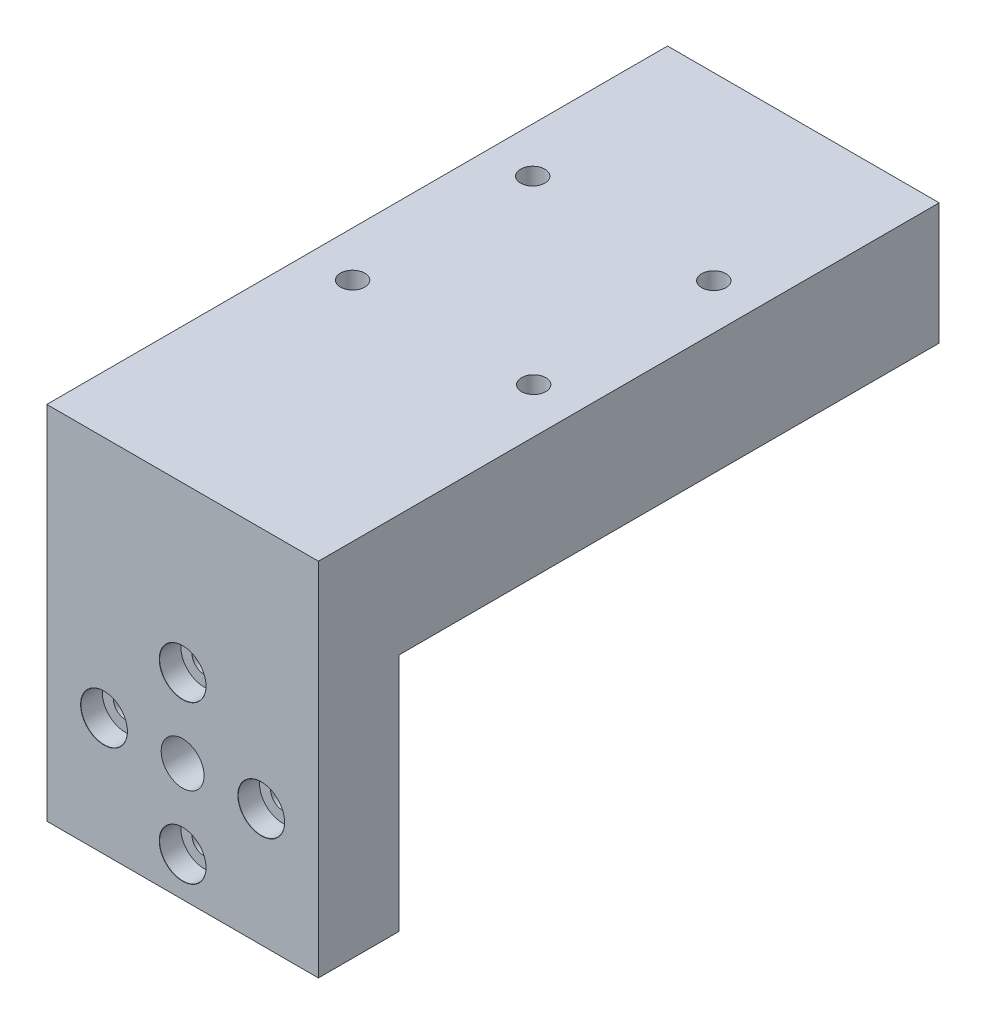
ISO-10303-21;
HEADER;
FILE_DESCRIPTION(('STEP AP214'),'2;1');
FILE_NAME('part.step','',(''),(''),'','','');
FILE_SCHEMA(('AUTOMOTIVE_DESIGN { 1 0 10303 214 1 1 1 1 }'));
ENDSEC;
DATA;
#1=APPLICATION_CONTEXT('core data for automotive mechanical design processes');
#2=APPLICATION_PROTOCOL_DEFINITION('international standard','automotive_design',2000,#1);
#3=PRODUCT_CONTEXT('',#1,'mechanical');
#4=PRODUCT('Part','Part','',(#3));
#5=PRODUCT_RELATED_PRODUCT_CATEGORY('part','',(#4));
#6=PRODUCT_DEFINITION_FORMATION('','',#4);
#7=PRODUCT_DEFINITION_CONTEXT('part definition',#1,'design');
#8=PRODUCT_DEFINITION('design','',#6,#7);
#9=PRODUCT_DEFINITION_SHAPE('','',#8);
#10=(LENGTH_UNIT() NAMED_UNIT(*) SI_UNIT(.MILLI.,.METRE.));
#11=(NAMED_UNIT(*) PLANE_ANGLE_UNIT() SI_UNIT($,.RADIAN.));
#12=(NAMED_UNIT(*) SI_UNIT($,.STERADIAN.) SOLID_ANGLE_UNIT());
#13=UNCERTAINTY_MEASURE_WITH_UNIT(LENGTH_MEASURE(1.E-05),#10,'distance_accuracy_value','');
#14=(GEOMETRIC_REPRESENTATION_CONTEXT(3) GLOBAL_UNCERTAINTY_ASSIGNED_CONTEXT((#13)) GLOBAL_UNIT_ASSIGNED_CONTEXT((#10,
#11,#12)) REPRESENTATION_CONTEXT('',''));
#15=CARTESIAN_POINT('',(0.,0.,0.));
#16=DIRECTION('',(0.,0.,1.));
#17=DIRECTION('',(1.,0.,0.));
#18=AXIS2_PLACEMENT_3D('',#15,#16,#17);
#19=CARTESIAN_POINT('',(0.,0.,36.6));
#20=DIRECTION('',(0.,0.,1.));
#21=DIRECTION('',(1.,0.,0.));
#22=AXIS2_PLACEMENT_3D('',#19,#20,#21);
#23=PLANE('',#22);
#24=CARTESIAN_POINT('',(0.,11.,36.6));
#25=DIRECTION('',(0.,0.,1.));
#26=DIRECTION('',(1.,0.,0.));
#27=AXIS2_PLACEMENT_3D('',#24,#25,#26);
#28=CIRCLE('',#27,1.69999999999999);
#29=CARTESIAN_POINT('',(1.69999999999999,11.,36.6));
#30=VERTEX_POINT('',#29);
#31=EDGE_CURVE('E3342',#30,#30,#28,.T.);
#32=ORIENTED_EDGE('',*,*,#31,.T.);
#33=EDGE_LOOP('',(#32));
#34=FACE_BOUND('',#33,.T.);
#35=CARTESIAN_POINT('',(11.,0.,36.6));
#36=DIRECTION('',(0.,0.,1.));
#37=DIRECTION('',(1.,0.,0.));
#38=AXIS2_PLACEMENT_3D('',#35,#36,#37);
#39=CIRCLE('',#38,1.69999999999999);
#40=CARTESIAN_POINT('',(12.7,0.,36.6));
#41=VERTEX_POINT('',#40);
#42=EDGE_CURVE('E3427',#41,#41,#39,.T.);
#43=ORIENTED_EDGE('',*,*,#42,.T.);
#44=EDGE_LOOP('',(#43));
#45=FACE_BOUND('',#44,.T.);
#46=CARTESIAN_POINT('',(0.,-11.,36.6));
#47=DIRECTION('',(0.,0.,1.));
#48=DIRECTION('',(1.,0.,0.));
#49=AXIS2_PLACEMENT_3D('',#46,#47,#48);
#50=CIRCLE('',#49,1.69999999999999);
#51=CARTESIAN_POINT('',(1.69999999999999,-11.,36.6));
#52=VERTEX_POINT('',#51);
#53=EDGE_CURVE('E3421',#52,#52,#50,.T.);
#54=ORIENTED_EDGE('',*,*,#53,.T.);
#55=EDGE_LOOP('',(#54));
#56=FACE_BOUND('',#55,.T.);
#57=CARTESIAN_POINT('',(-11.,0.,36.6));
#58=DIRECTION('',(0.,0.,1.));
#59=DIRECTION('',(1.,0.,0.));
#60=AXIS2_PLACEMENT_3D('',#57,#58,#59);
#61=CIRCLE('',#60,1.69999999999999);
#62=CARTESIAN_POINT('',(-9.30000000000001,0.,36.6));
#63=VERTEX_POINT('',#62);
#64=EDGE_CURVE('E3413',#63,#63,#61,.T.);
#65=ORIENTED_EDGE('',*,*,#64,.T.);
#66=EDGE_LOOP('',(#65));
#67=FACE_BOUND('',#66,.T.);
#68=CARTESIAN_POINT('',(0.,0.,36.6));
#69=DIRECTION('',(0.,0.,-1.));
#70=DIRECTION('',(-1.,0.,0.));
#71=AXIS2_PLACEMENT_3D('',#68,#69,#70);
#72=CIRCLE('',#71,9.05);
#73=CARTESIAN_POINT('',(-9.05,0.,36.6));
#74=VERTEX_POINT('',#73);
#75=EDGE_CURVE('E3478',#74,#74,#72,.T.);
#76=ORIENTED_EDGE('',*,*,#75,.F.);
#77=EDGE_LOOP('',(#76));
#78=FACE_BOUND('',#77,.T.);
#79=DIRECTION('',(0.,-1.,0.));
#80=VECTOR('',#79,1.);
#81=CARTESIAN_POINT('',(19.,0.,36.6));
#82=LINE('',#81,#80);
#83=CARTESIAN_POINT('',(19.,17.,36.6));
#84=VERTEX_POINT('',#83);
#85=CARTESIAN_POINT('',(19.,-16.5,36.6));
#86=VERTEX_POINT('',#85);
#87=EDGE_CURVE('E3382',#84,#86,#82,.T.);
#88=ORIENTED_EDGE('',*,*,#87,.T.);
#89=DIRECTION('',(1.,0.,0.));
#90=VECTOR('',#89,1.);
#91=CARTESIAN_POINT('',(0.,-16.5,36.6));
#92=LINE('',#91,#90);
#93=CARTESIAN_POINT('',(-19.,-16.5,36.6));
#94=VERTEX_POINT('',#93);
#95=EDGE_CURVE('E3395',#94,#86,#92,.T.);
#96=ORIENTED_EDGE('',*,*,#95,.F.);
#97=DIRECTION('',(0.,-1.,0.));
#98=VECTOR('',#97,1.);
#99=CARTESIAN_POINT('',(-19.,0.,36.6));
#100=LINE('',#99,#98);
#101=CARTESIAN_POINT('',(-19.,17.,36.6));
#102=VERTEX_POINT('',#101);
#103=EDGE_CURVE('E3374',#102,#94,#100,.T.);
#104=ORIENTED_EDGE('',*,*,#103,.F.);
#105=DIRECTION('',(1.,0.,0.));
#106=VECTOR('',#105,1.);
#107=CARTESIAN_POINT('',(0.,17.,36.6));
#108=LINE('',#107,#106);
#109=EDGE_CURVE('E3398',#102,#84,#108,.T.);
#110=ORIENTED_EDGE('',*,*,#109,.T.);
#111=EDGE_LOOP('',(#88,#96,#104,#110));
#112=FACE_BOUND('',#111,.T.);
#113=ADVANCED_FACE('F3337',(#34,#45,#56,#67,#78,#112),#23,.F.);
#114=CARTESIAN_POINT('',(-19.,0.,47.85));
#115=DIRECTION('',(1.,0.,0.));
#116=DIRECTION('',(0.,1.,0.));
#117=AXIS2_PLACEMENT_3D('',#114,#115,#116);
#118=PLANE('',#117);
#119=ORIENTED_EDGE('',*,*,#103,.T.);
#120=DIRECTION('',(0.,0.,-1.));
#121=VECTOR('',#120,1.);
#122=CARTESIAN_POINT('',(-19.,-16.5,47.85));
#123=LINE('',#122,#121);
#124=CARTESIAN_POINT('',(-19.,-16.5,47.85));
#125=VERTEX_POINT('',#124);
#126=EDGE_CURVE('E3351',#125,#94,#123,.T.);
#127=ORIENTED_EDGE('',*,*,#126,.F.);
#128=DIRECTION('',(0.,-1.,0.));
#129=VECTOR('',#128,1.);
#130=CARTESIAN_POINT('',(-19.,0.,47.85));
#131=LINE('',#130,#129);
#132=CARTESIAN_POINT('',(-19.,34.,47.85));
#133=VERTEX_POINT('',#132);
#134=EDGE_CURVE('E3516',#133,#125,#131,.T.);
#135=ORIENTED_EDGE('',*,*,#134,.F.);
#136=DIRECTION('',(0.,0.,1.));
#137=VECTOR('',#136,1.);
#138=CARTESIAN_POINT('',(-19.,34.,-39.));
#139=LINE('',#138,#137);
#140=CARTESIAN_POINT('',(-19.,34.,-39.));
#141=VERTEX_POINT('',#140);
#142=EDGE_CURVE('E3507',#141,#133,#139,.T.);
#143=ORIENTED_EDGE('',*,*,#142,.F.);
#144=DIRECTION('',(0.,1.,0.));
#145=VECTOR('',#144,1.);
#146=CARTESIAN_POINT('',(-19.,0.,-39.));
#147=LINE('',#146,#145);
#148=CARTESIAN_POINT('',(-19.,17.,-39.));
#149=VERTEX_POINT('',#148);
#150=EDGE_CURVE('E3496',#149,#141,#147,.T.);
#151=ORIENTED_EDGE('',*,*,#150,.F.);
#152=DIRECTION('',(0.,0.,1.));
#153=VECTOR('',#152,1.);
#154=CARTESIAN_POINT('',(-19.,17.,-39.));
#155=LINE('',#154,#153);
#156=EDGE_CURVE('E3406',#149,#102,#155,.T.);
#157=ORIENTED_EDGE('',*,*,#156,.T.);
#158=EDGE_LOOP('',(#119,#127,#135,#143,#151,#157));
#159=FACE_BOUND('',#158,.T.);
#160=ADVANCED_FACE('F3529',(#159),#118,.F.);
#161=CARTESIAN_POINT('',(19.,0.,47.85));
#162=DIRECTION('',(1.,0.,0.));
#163=DIRECTION('',(0.,1.,0.));
#164=AXIS2_PLACEMENT_3D('',#161,#162,#163);
#165=PLANE('',#164);
#166=ORIENTED_EDGE('',*,*,#87,.F.);
#167=DIRECTION('',(0.,0.,1.));
#168=VECTOR('',#167,1.);
#169=CARTESIAN_POINT('',(19.,17.,-39.));
#170=LINE('',#169,#168);
#171=CARTESIAN_POINT('',(19.,17.,-39.));
#172=VERTEX_POINT('',#171);
#173=EDGE_CURVE('E3399',#172,#84,#170,.T.);
#174=ORIENTED_EDGE('',*,*,#173,.F.);
#175=DIRECTION('',(0.,-1.,0.));
#176=VECTOR('',#175,1.);
#177=CARTESIAN_POINT('',(19.,0.,-39.));
#178=LINE('',#177,#176);
#179=CARTESIAN_POINT('',(19.,34.,-39.));
#180=VERTEX_POINT('',#179);
#181=EDGE_CURVE('E3486',#180,#172,#178,.T.);
#182=ORIENTED_EDGE('',*,*,#181,.F.);
#183=DIRECTION('',(0.,0.,1.));
#184=VECTOR('',#183,1.);
#185=CARTESIAN_POINT('',(19.,34.,-39.));
#186=LINE('',#185,#184);
#187=CARTESIAN_POINT('',(19.,34.,47.85));
#188=VERTEX_POINT('',#187);
#189=EDGE_CURVE('E3502',#180,#188,#186,.T.);
#190=ORIENTED_EDGE('',*,*,#189,.T.);
#191=DIRECTION('',(0.,-1.,0.));
#192=VECTOR('',#191,1.);
#193=CARTESIAN_POINT('',(19.,0.,47.85));
#194=LINE('',#193,#192);
#195=CARTESIAN_POINT('',(19.,-16.5,47.85));
#196=VERTEX_POINT('',#195);
#197=EDGE_CURVE('E3387',#188,#196,#194,.T.);
#198=ORIENTED_EDGE('',*,*,#197,.T.);
#199=DIRECTION('',(0.,0.,-1.));
#200=VECTOR('',#199,1.);
#201=CARTESIAN_POINT('',(19.,-16.5,47.85));
#202=LINE('',#201,#200);
#203=EDGE_CURVE('E3376',#196,#86,#202,.T.);
#204=ORIENTED_EDGE('',*,*,#203,.T.);
#205=EDGE_LOOP('',(#166,#174,#182,#190,#198,#204));
#206=FACE_BOUND('',#205,.T.);
#207=ADVANCED_FACE('F3345',(#206),#165,.T.);
#208=CARTESIAN_POINT('',(0.,-16.5,47.85));
#209=DIRECTION('',(0.,1.,0.));
#210=DIRECTION('',(0.,0.,1.));
#211=AXIS2_PLACEMENT_3D('',#208,#209,#210);
#212=PLANE('',#211);
#213=ORIENTED_EDGE('',*,*,#95,.T.);
#214=ORIENTED_EDGE('',*,*,#203,.F.);
#215=DIRECTION('',(1.,0.,0.));
#216=VECTOR('',#215,1.);
#217=CARTESIAN_POINT('',(0.,-16.5,47.85));
#218=LINE('',#217,#216);
#219=EDGE_CURVE('E3358',#125,#196,#218,.T.);
#220=ORIENTED_EDGE('',*,*,#219,.F.);
#221=ORIENTED_EDGE('',*,*,#126,.T.);
#222=EDGE_LOOP('',(#213,#214,#220,#221));
#223=FACE_BOUND('',#222,.T.);
#224=ADVANCED_FACE('F3391',(#223),#212,.F.);
#225=CARTESIAN_POINT('',(0.,0.,47.85));
#226=DIRECTION('',(0.,0.,1.));
#227=DIRECTION('',(1.,0.,0.));
#228=AXIS2_PLACEMENT_3D('',#225,#226,#227);
#229=PLANE('',#228);
#230=CARTESIAN_POINT('',(0.,11.,47.85));
#231=DIRECTION('',(0.,0.,1.));
#232=DIRECTION('',(1.,0.,0.));
#233=AXIS2_PLACEMENT_3D('',#230,#231,#232);
#234=CIRCLE('',#233,3.275);
#235=CARTESIAN_POINT('',(3.275,11.,47.85));
#236=VERTEX_POINT('',#235);
#237=EDGE_CURVE('E3777',#236,#236,#234,.T.);
#238=ORIENTED_EDGE('',*,*,#237,.F.);
#239=EDGE_LOOP('',(#238));
#240=FACE_BOUND('',#239,.T.);
#241=CARTESIAN_POINT('',(11.,0.,47.85));
#242=DIRECTION('',(0.,0.,1.));
#243=DIRECTION('',(1.,0.,0.));
#244=AXIS2_PLACEMENT_3D('',#241,#242,#243);
#245=CIRCLE('',#244,3.275);
#246=CARTESIAN_POINT('',(14.275,0.,47.85));
#247=VERTEX_POINT('',#246);
#248=EDGE_CURVE('E3797',#247,#247,#245,.T.);
#249=ORIENTED_EDGE('',*,*,#248,.F.);
#250=EDGE_LOOP('',(#249));
#251=FACE_BOUND('',#250,.T.);
#252=CARTESIAN_POINT('',(0.,-11.,47.85));
#253=DIRECTION('',(0.,0.,1.));
#254=DIRECTION('',(1.,0.,0.));
#255=AXIS2_PLACEMENT_3D('',#252,#253,#254);
#256=CIRCLE('',#255,3.275);
#257=CARTESIAN_POINT('',(3.275,-11.,47.85));
#258=VERTEX_POINT('',#257);
#259=EDGE_CURVE('E3429',#258,#258,#256,.T.);
#260=ORIENTED_EDGE('',*,*,#259,.F.);
#261=EDGE_LOOP('',(#260));
#262=FACE_BOUND('',#261,.T.);
#263=CARTESIAN_POINT('',(-11.,0.,47.85));
#264=DIRECTION('',(0.,0.,1.));
#265=DIRECTION('',(1.,0.,0.));
#266=AXIS2_PLACEMENT_3D('',#263,#264,#265);
#267=CIRCLE('',#266,3.275);
#268=CARTESIAN_POINT('',(-7.725,0.,47.85));
#269=VERTEX_POINT('',#268);
#270=EDGE_CURVE('E3422',#269,#269,#267,.T.);
#271=ORIENTED_EDGE('',*,*,#270,.F.);
#272=EDGE_LOOP('',(#271));
#273=FACE_BOUND('',#272,.T.);
#274=CARTESIAN_POINT('',(0.,0.,47.85));
#275=DIRECTION('',(0.,0.,1.));
#276=DIRECTION('',(1.,0.,0.));
#277=AXIS2_PLACEMENT_3D('',#274,#275,#276);
#278=CIRCLE('',#277,3.);
#279=CARTESIAN_POINT('',(3.,0.,47.85));
#280=VERTEX_POINT('',#279);
#281=EDGE_CURVE('E12',#280,#280,#278,.T.);
#282=ORIENTED_EDGE('',*,*,#281,.F.);
#283=EDGE_LOOP('',(#282));
#284=FACE_BOUND('',#283,.T.);
#285=ORIENTED_EDGE('',*,*,#197,.F.);
#286=DIRECTION('',(1.,0.,0.));
#287=VECTOR('',#286,1.);
#288=CARTESIAN_POINT('',(0.,34.,47.85));
#289=LINE('',#288,#287);
#290=EDGE_CURVE('E3481',#133,#188,#289,.T.);
#291=ORIENTED_EDGE('',*,*,#290,.F.);
#292=ORIENTED_EDGE('',*,*,#134,.T.);
#293=ORIENTED_EDGE('',*,*,#219,.T.);
#294=EDGE_LOOP('',(#285,#291,#292,#293));
#295=FACE_BOUND('',#294,.T.);
#296=ADVANCED_FACE('F3527',(#240,#251,#262,#273,#284,#295),#229,.T.);
#297=CARTESIAN_POINT('',(0.,17.,-39.));
#298=DIRECTION('',(0.,-1.,0.));
#299=DIRECTION('',(0.,0.,-1.));
#300=AXIS2_PLACEMENT_3D('',#297,#298,#299);
#301=PLANE('',#300);
#302=CARTESIAN_POINT('',(-12.6666666666667,17.,11.4));
#303=DIRECTION('',(0.,-1.,0.));
#304=DIRECTION('',(0.,0.,-1.));
#305=AXIS2_PLACEMENT_3D('',#302,#303,#304);
#306=CIRCLE('',#305,3.275);
#307=CARTESIAN_POINT('',(-12.6666666666667,17.,8.125));
#308=VERTEX_POINT('',#307);
#309=EDGE_CURVE('E3702',#308,#308,#306,.T.);
#310=ORIENTED_EDGE('',*,*,#309,.F.);
#311=EDGE_LOOP('',(#310));
#312=FACE_BOUND('',#311,.T.);
#313=CARTESIAN_POINT('',(12.6666666666667,17.,11.4));
#314=DIRECTION('',(0.,-1.,0.));
#315=DIRECTION('',(0.,0.,-1.));
#316=AXIS2_PLACEMENT_3D('',#313,#314,#315);
#317=CIRCLE('',#316,3.275);
#318=CARTESIAN_POINT('',(12.6666666666667,17.,8.125));
#319=VERTEX_POINT('',#318);
#320=EDGE_CURVE('E3719',#319,#319,#317,.T.);
#321=ORIENTED_EDGE('',*,*,#320,.F.);
#322=EDGE_LOOP('',(#321));
#323=FACE_BOUND('',#322,.T.);
#324=CARTESIAN_POINT('',(12.6666666666667,17.,-13.8));
#325=DIRECTION('',(0.,-1.,0.));
#326=DIRECTION('',(0.,0.,-1.));
#327=AXIS2_PLACEMENT_3D('',#324,#325,#326);
#328=CIRCLE('',#327,3.275);
#329=CARTESIAN_POINT('',(12.6666666666667,17.,-17.075));
#330=VERTEX_POINT('',#329);
#331=EDGE_CURVE('E3739',#330,#330,#328,.T.);
#332=ORIENTED_EDGE('',*,*,#331,.F.);
#333=EDGE_LOOP('',(#332));
#334=FACE_BOUND('',#333,.T.);
#335=CARTESIAN_POINT('',(-12.6666666666667,17.,-13.8));
#336=DIRECTION('',(0.,-1.,0.));
#337=DIRECTION('',(0.,0.,-1.));
#338=AXIS2_PLACEMENT_3D('',#335,#336,#337);
#339=CIRCLE('',#338,3.275);
#340=CARTESIAN_POINT('',(-12.6666666666667,17.,-17.075));
#341=VERTEX_POINT('',#340);
#342=EDGE_CURVE('E3758',#341,#341,#339,.T.);
#343=ORIENTED_EDGE('',*,*,#342,.F.);
#344=EDGE_LOOP('',(#343));
#345=FACE_BOUND('',#344,.T.);
#346=ORIENTED_EDGE('',*,*,#109,.F.);
#347=ORIENTED_EDGE('',*,*,#156,.F.);
#348=DIRECTION('',(1.,0.,0.));
#349=VECTOR('',#348,1.);
#350=CARTESIAN_POINT('',(0.,17.,-39.));
#351=LINE('',#350,#349);
#352=EDGE_CURVE('E3505',#149,#172,#351,.T.);
#353=ORIENTED_EDGE('',*,*,#352,.T.);
#354=ORIENTED_EDGE('',*,*,#173,.T.);
#355=EDGE_LOOP('',(#346,#347,#353,#354));
#356=FACE_BOUND('',#355,.T.);
#357=ADVANCED_FACE('F3545',(#312,#323,#334,#345,#356),#301,.T.);
#358=CARTESIAN_POINT('',(0.,34.,-39.));
#359=DIRECTION('',(0.,-1.,0.));
#360=DIRECTION('',(0.,0.,-1.));
#361=AXIS2_PLACEMENT_3D('',#358,#359,#360);
#362=PLANE('',#361);
#363=CARTESIAN_POINT('',(-12.6666666666667,34.,11.4));
#364=DIRECTION('',(0.,-1.,0.));
#365=DIRECTION('',(0.,0.,-1.));
#366=AXIS2_PLACEMENT_3D('',#363,#364,#365);
#367=CIRCLE('',#366,1.7);
#368=CARTESIAN_POINT('',(-12.6666666666667,34.,9.7));
#369=VERTEX_POINT('',#368);
#370=EDGE_CURVE('E3718',#369,#369,#367,.T.);
#371=ORIENTED_EDGE('',*,*,#370,.T.);
#372=EDGE_LOOP('',(#371));
#373=FACE_BOUND('',#372,.T.);
#374=CARTESIAN_POINT('',(12.6666666666667,34.,11.4));
#375=DIRECTION('',(0.,-1.,0.));
#376=DIRECTION('',(0.,0.,-1.));
#377=AXIS2_PLACEMENT_3D('',#374,#375,#376);
#378=CIRCLE('',#377,1.7);
#379=CARTESIAN_POINT('',(12.6666666666667,34.,9.7));
#380=VERTEX_POINT('',#379);
#381=EDGE_CURVE('E3736',#380,#380,#378,.T.);
#382=ORIENTED_EDGE('',*,*,#381,.T.);
#383=EDGE_LOOP('',(#382));
#384=FACE_BOUND('',#383,.T.);
#385=CARTESIAN_POINT('',(12.6666666666667,34.,-13.8));
#386=DIRECTION('',(0.,-1.,0.));
#387=DIRECTION('',(0.,0.,-1.));
#388=AXIS2_PLACEMENT_3D('',#385,#386,#387);
#389=CIRCLE('',#388,1.7);
#390=CARTESIAN_POINT('',(12.6666666666667,34.,-15.5));
#391=VERTEX_POINT('',#390);
#392=EDGE_CURVE('E3757',#391,#391,#389,.T.);
#393=ORIENTED_EDGE('',*,*,#392,.T.);
#394=EDGE_LOOP('',(#393));
#395=FACE_BOUND('',#394,.T.);
#396=CARTESIAN_POINT('',(-12.6666666666667,34.,-13.8));
#397=DIRECTION('',(0.,-1.,0.));
#398=DIRECTION('',(0.,0.,-1.));
#399=AXIS2_PLACEMENT_3D('',#396,#397,#398);
#400=CIRCLE('',#399,1.7);
#401=CARTESIAN_POINT('',(-12.6666666666667,34.,-15.5));
#402=VERTEX_POINT('',#401);
#403=EDGE_CURVE('E3778',#402,#402,#400,.T.);
#404=ORIENTED_EDGE('',*,*,#403,.T.);
#405=EDGE_LOOP('',(#404));
#406=FACE_BOUND('',#405,.T.);
#407=ORIENTED_EDGE('',*,*,#142,.T.);
#408=ORIENTED_EDGE('',*,*,#290,.T.);
#409=ORIENTED_EDGE('',*,*,#189,.F.);
#410=DIRECTION('',(1.,0.,0.));
#411=VECTOR('',#410,1.);
#412=CARTESIAN_POINT('',(0.,34.,-39.));
#413=LINE('',#412,#411);
#414=EDGE_CURVE('E3492',#141,#180,#413,.T.);
#415=ORIENTED_EDGE('',*,*,#414,.F.);
#416=EDGE_LOOP('',(#407,#408,#409,#415));
#417=FACE_BOUND('',#416,.T.);
#418=ADVANCED_FACE('F3544',(#373,#384,#395,#406,#417),#362,.F.);
#419=CARTESIAN_POINT('',(0.,0.,-39.));
#420=DIRECTION('',(0.,0.,1.));
#421=DIRECTION('',(1.,0.,0.));
#422=AXIS2_PLACEMENT_3D('',#419,#420,#421);
#423=PLANE('',#422);
#424=ORIENTED_EDGE('',*,*,#181,.T.);
#425=ORIENTED_EDGE('',*,*,#352,.F.);
#426=ORIENTED_EDGE('',*,*,#150,.T.);
#427=ORIENTED_EDGE('',*,*,#414,.T.);
#428=EDGE_LOOP('',(#424,#425,#426,#427));
#429=FACE_BOUND('',#428,.T.);
#430=ADVANCED_FACE('F3550',(#429),#423,.F.);
#431=CARTESIAN_POINT('',(0.,0.,38.6));
#432=DIRECTION('',(0.,0.,-1.));
#433=DIRECTION('',(-1.,0.,0.));
#434=AXIS2_PLACEMENT_3D('',#431,#432,#433);
#435=CYLINDRICAL_SURFACE('',#434,9.05);
#436=CARTESIAN_POINT('',(0.,0.,38.6));
#437=DIRECTION('',(0.,0.,-1.));
#438=DIRECTION('',(-1.,0.,0.));
#439=AXIS2_PLACEMENT_3D('',#436,#437,#438);
#440=CIRCLE('',#439,9.05);
#441=CARTESIAN_POINT('',(-9.05,0.,38.6));
#442=VERTEX_POINT('',#441);
#443=EDGE_CURVE('E3477',#442,#442,#440,.T.);
#444=ORIENTED_EDGE('',*,*,#443,.F.);
#445=EDGE_LOOP('',(#444));
#446=FACE_BOUND('',#445,.T.);
#447=ORIENTED_EDGE('',*,*,#75,.T.);
#448=EDGE_LOOP('',(#447));
#449=FACE_BOUND('',#448,.T.);
#450=ADVANCED_FACE('F3555',(#446,#449),#435,.F.);
#451=CARTESIAN_POINT('',(0.,0.,38.6));
#452=DIRECTION('',(0.,0.,-1.));
#453=DIRECTION('',(-1.,0.,0.));
#454=AXIS2_PLACEMENT_3D('',#451,#452,#453);
#455=PLANE('',#454);
#456=CARTESIAN_POINT('',(0.,0.,38.6));
#457=DIRECTION('',(0.,0.,-1.));
#458=DIRECTION('',(-1.,0.,0.));
#459=AXIS2_PLACEMENT_3D('',#456,#457,#458);
#460=CIRCLE('',#459,3.);
#461=CARTESIAN_POINT('',(-3.,0.,38.6));
#462=VERTEX_POINT('',#461);
#463=EDGE_CURVE('E3419',#462,#462,#460,.T.);
#464=ORIENTED_EDGE('',*,*,#463,.F.);
#465=EDGE_LOOP('',(#464));
#466=FACE_BOUND('',#465,.T.);
#467=ORIENTED_EDGE('',*,*,#443,.T.);
#468=EDGE_LOOP('',(#467));
#469=FACE_BOUND('',#468,.T.);
#470=ADVANCED_FACE('F3556',(#466,#469),#455,.T.);
#471=CARTESIAN_POINT('',(0.,0.,54.601));
#472=DIRECTION('',(0.,0.,-1.));
#473=DIRECTION('',(-1.,0.,0.));
#474=AXIS2_PLACEMENT_3D('',#471,#472,#473);
#475=CYLINDRICAL_SURFACE('',#474,3.);
#476=ORIENTED_EDGE('',*,*,#281,.T.);
#477=EDGE_LOOP('',(#476));
#478=FACE_BOUND('',#477,.T.);
#479=ORIENTED_EDGE('',*,*,#463,.T.);
#480=EDGE_LOOP('',(#479));
#481=FACE_BOUND('',#480,.T.);
#482=ADVANCED_FACE('F3565',(#478,#481),#475,.F.);
#483=CARTESIAN_POINT('',(-11.,0.,47.85));
#484=DIRECTION('',(0.,0.,1.));
#485=DIRECTION('',(1.,0.,0.));
#486=AXIS2_PLACEMENT_3D('',#483,#484,#485);
#487=CYLINDRICAL_SURFACE('',#486,1.69999999999999);
#488=CARTESIAN_POINT('',(-11.,0.,44.85));
#489=DIRECTION('',(0.,0.,1.));
#490=DIRECTION('',(1.,0.,0.));
#491=AXIS2_PLACEMENT_3D('',#488,#489,#490);
#492=CIRCLE('',#491,1.7);
#493=CARTESIAN_POINT('',(-9.3,0.,44.85));
#494=VERTEX_POINT('',#493);
#495=EDGE_CURVE('E3416',#494,#494,#492,.T.);
#496=ORIENTED_EDGE('',*,*,#495,.T.);
#497=EDGE_LOOP('',(#496));
#498=FACE_BOUND('',#497,.T.);
#499=ORIENTED_EDGE('',*,*,#64,.F.);
#500=EDGE_LOOP('',(#499));
#501=FACE_BOUND('',#500,.T.);
#502=ADVANCED_FACE('F3566',(#498,#501),#487,.F.);
#503=CARTESIAN_POINT('',(-7.75,0.,44.85));
#504=DIRECTION('',(0.,0.,-1.));
#505=DIRECTION('',(-1.,0.,0.));
#506=AXIS2_PLACEMENT_3D('',#503,#504,#505);
#507=PLANE('',#506);
#508=ORIENTED_EDGE('',*,*,#495,.F.);
#509=EDGE_LOOP('',(#508));
#510=FACE_BOUND('',#509,.T.);
#511=CARTESIAN_POINT('',(-11.,0.,44.85));
#512=DIRECTION('',(0.,0.,1.));
#513=DIRECTION('',(1.,0.,0.));
#514=AXIS2_PLACEMENT_3D('',#511,#512,#513);
#515=CIRCLE('',#514,3.25);
#516=CARTESIAN_POINT('',(-7.75,0.,44.85));
#517=VERTEX_POINT('',#516);
#518=EDGE_CURVE('E3469',#517,#517,#515,.T.);
#519=ORIENTED_EDGE('',*,*,#518,.T.);
#520=EDGE_LOOP('',(#519));
#521=FACE_BOUND('',#520,.T.);
#522=ADVANCED_FACE('F3569',(#510,#521),#507,.F.);
#523=CARTESIAN_POINT('',(-11.,0.,47.85));
#524=DIRECTION('',(0.,0.,1.));
#525=DIRECTION('',(1.,0.,0.));
#526=AXIS2_PLACEMENT_3D('',#523,#524,#525);
#527=CYLINDRICAL_SURFACE('',#526,3.25);
#528=ORIENTED_EDGE('',*,*,#518,.F.);
#529=EDGE_LOOP('',(#528));
#530=FACE_BOUND('',#529,.T.);
#531=CARTESIAN_POINT('',(-11.,0.,47.825));
#532=DIRECTION('',(0.,0.,1.));
#533=DIRECTION('',(1.,0.,0.));
#534=AXIS2_PLACEMENT_3D('',#531,#532,#533);
#535=CIRCLE('',#534,3.25);
#536=CARTESIAN_POINT('',(-7.75,0.,47.825));
#537=VERTEX_POINT('',#536);
#538=EDGE_CURVE('E3463',#537,#537,#535,.T.);
#539=ORIENTED_EDGE('',*,*,#538,.T.);
#540=EDGE_LOOP('',(#539));
#541=FACE_BOUND('',#540,.T.);
#542=ADVANCED_FACE('F3573',(#530,#541),#527,.F.);
#543=CARTESIAN_POINT('',(-11.,0.,47.85));
#544=DIRECTION('',(0.,0.,1.));
#545=DIRECTION('',(1.,0.,0.));
#546=AXIS2_PLACEMENT_3D('',#543,#544,#545);
#547=CONICAL_SURFACE('',#546,3.275,0.785398163397518);
#548=ORIENTED_EDGE('',*,*,#538,.F.);
#549=EDGE_LOOP('',(#548));
#550=FACE_BOUND('',#549,.T.);
#551=ORIENTED_EDGE('',*,*,#270,.T.);
#552=EDGE_LOOP('',(#551));
#553=FACE_BOUND('',#552,.T.);
#554=ADVANCED_FACE('F3579',(#550,#553),#547,.F.);
#555=CARTESIAN_POINT('',(0.,-11.,47.85));
#556=DIRECTION('',(0.,0.,1.));
#557=DIRECTION('',(1.,0.,0.));
#558=AXIS2_PLACEMENT_3D('',#555,#556,#557);
#559=CYLINDRICAL_SURFACE('',#558,1.69999999999999);
#560=CARTESIAN_POINT('',(0.,-11.,44.85));
#561=DIRECTION('',(0.,0.,1.));
#562=DIRECTION('',(1.,0.,0.));
#563=AXIS2_PLACEMENT_3D('',#560,#561,#562);
#564=CIRCLE('',#563,1.7);
#565=CARTESIAN_POINT('',(1.7,-11.,44.85));
#566=VERTEX_POINT('',#565);
#567=EDGE_CURVE('E3424',#566,#566,#564,.T.);
#568=ORIENTED_EDGE('',*,*,#567,.T.);
#569=EDGE_LOOP('',(#568));
#570=FACE_BOUND('',#569,.T.);
#571=ORIENTED_EDGE('',*,*,#53,.F.);
#572=EDGE_LOOP('',(#571));
#573=FACE_BOUND('',#572,.T.);
#574=ADVANCED_FACE('F3585',(#570,#573),#559,.F.);
#575=CARTESIAN_POINT('',(3.25,-11.,44.85));
#576=DIRECTION('',(0.,0.,-1.));
#577=DIRECTION('',(-1.,0.,0.));
#578=AXIS2_PLACEMENT_3D('',#575,#576,#577);
#579=PLANE('',#578);
#580=ORIENTED_EDGE('',*,*,#567,.F.);
#581=EDGE_LOOP('',(#580));
#582=FACE_BOUND('',#581,.T.);
#583=CARTESIAN_POINT('',(0.,-11.,44.85));
#584=DIRECTION('',(0.,0.,1.));
#585=DIRECTION('',(1.,0.,0.));
#586=AXIS2_PLACEMENT_3D('',#583,#584,#585);
#587=CIRCLE('',#586,3.25);
#588=CARTESIAN_POINT('',(3.25,-11.,44.85));
#589=VERTEX_POINT('',#588);
#590=EDGE_CURVE('E3452',#589,#589,#587,.T.);
#591=ORIENTED_EDGE('',*,*,#590,.T.);
#592=EDGE_LOOP('',(#591));
#593=FACE_BOUND('',#592,.T.);
#594=ADVANCED_FACE('F3586',(#582,#593),#579,.F.);
#595=CARTESIAN_POINT('',(0.,-11.,47.85));
#596=DIRECTION('',(0.,0.,1.));
#597=DIRECTION('',(1.,0.,0.));
#598=AXIS2_PLACEMENT_3D('',#595,#596,#597);
#599=CYLINDRICAL_SURFACE('',#598,3.25);
#600=ORIENTED_EDGE('',*,*,#590,.F.);
#601=EDGE_LOOP('',(#600));
#602=FACE_BOUND('',#601,.T.);
#603=CARTESIAN_POINT('',(0.,-11.,47.825));
#604=DIRECTION('',(0.,0.,1.));
#605=DIRECTION('',(1.,0.,0.));
#606=AXIS2_PLACEMENT_3D('',#603,#604,#605);
#607=CIRCLE('',#606,3.25);
#608=CARTESIAN_POINT('',(3.25,-11.,47.825));
#609=VERTEX_POINT('',#608);
#610=EDGE_CURVE('E3440',#609,#609,#607,.T.);
#611=ORIENTED_EDGE('',*,*,#610,.T.);
#612=EDGE_LOOP('',(#611));
#613=FACE_BOUND('',#612,.T.);
#614=ADVANCED_FACE('F3589',(#602,#613),#599,.F.);
#615=CARTESIAN_POINT('',(0.,-11.,47.85));
#616=DIRECTION('',(0.,0.,1.));
#617=DIRECTION('',(1.,0.,0.));
#618=AXIS2_PLACEMENT_3D('',#615,#616,#617);
#619=CONICAL_SURFACE('',#618,3.275,0.785398163397518);
#620=ORIENTED_EDGE('',*,*,#610,.F.);
#621=EDGE_LOOP('',(#620));
#622=FACE_BOUND('',#621,.T.);
#623=ORIENTED_EDGE('',*,*,#259,.T.);
#624=EDGE_LOOP('',(#623));
#625=FACE_BOUND('',#624,.T.);
#626=ADVANCED_FACE('F3594',(#622,#625),#619,.F.);
#627=CARTESIAN_POINT('',(11.,0.,47.85));
#628=DIRECTION('',(0.,0.,1.));
#629=DIRECTION('',(1.,0.,0.));
#630=AXIS2_PLACEMENT_3D('',#627,#628,#629);
#631=CYLINDRICAL_SURFACE('',#630,1.69999999999999);
#632=CARTESIAN_POINT('',(11.,0.,44.85));
#633=DIRECTION('',(0.,0.,1.));
#634=DIRECTION('',(1.,0.,0.));
#635=AXIS2_PLACEMENT_3D('',#632,#633,#634);
#636=CIRCLE('',#635,1.7);
#637=CARTESIAN_POINT('',(12.7,0.,44.85));
#638=VERTEX_POINT('',#637);
#639=EDGE_CURVE('E3428',#638,#638,#636,.T.);
#640=ORIENTED_EDGE('',*,*,#639,.T.);
#641=EDGE_LOOP('',(#640));
#642=FACE_BOUND('',#641,.T.);
#643=ORIENTED_EDGE('',*,*,#42,.F.);
#644=EDGE_LOOP('',(#643));
#645=FACE_BOUND('',#644,.T.);
#646=ADVANCED_FACE('F3598',(#642,#645),#631,.F.);
#647=CARTESIAN_POINT('',(14.25,0.,44.85));
#648=DIRECTION('',(0.,0.,-1.));
#649=DIRECTION('',(-1.,0.,0.));
#650=AXIS2_PLACEMENT_3D('',#647,#648,#649);
#651=PLANE('',#650);
#652=ORIENTED_EDGE('',*,*,#639,.F.);
#653=EDGE_LOOP('',(#652));
#654=FACE_BOUND('',#653,.T.);
#655=CARTESIAN_POINT('',(11.,0.,44.85));
#656=DIRECTION('',(0.,0.,1.));
#657=DIRECTION('',(1.,0.,0.));
#658=AXIS2_PLACEMENT_3D('',#655,#656,#657);
#659=CIRCLE('',#658,3.25);
#660=CARTESIAN_POINT('',(14.25,0.,44.85));
#661=VERTEX_POINT('',#660);
#662=EDGE_CURVE('E3439',#661,#661,#659,.T.);
#663=ORIENTED_EDGE('',*,*,#662,.T.);
#664=EDGE_LOOP('',(#663));
#665=FACE_BOUND('',#664,.T.);
#666=ADVANCED_FACE('F3605',(#654,#665),#651,.F.);
#667=CARTESIAN_POINT('',(11.,0.,47.85));
#668=DIRECTION('',(0.,0.,1.));
#669=DIRECTION('',(1.,0.,0.));
#670=AXIS2_PLACEMENT_3D('',#667,#668,#669);
#671=CYLINDRICAL_SURFACE('',#670,3.25);
#672=ORIENTED_EDGE('',*,*,#662,.F.);
#673=EDGE_LOOP('',(#672));
#674=FACE_BOUND('',#673,.T.);
#675=CARTESIAN_POINT('',(11.,0.,47.825));
#676=DIRECTION('',(0.,0.,1.));
#677=DIRECTION('',(1.,0.,0.));
#678=AXIS2_PLACEMENT_3D('',#675,#676,#677);
#679=CIRCLE('',#678,3.25);
#680=CARTESIAN_POINT('',(14.25,0.,47.825));
#681=VERTEX_POINT('',#680);
#682=EDGE_CURVE('E3450',#681,#681,#679,.T.);
#683=ORIENTED_EDGE('',*,*,#682,.T.);
#684=EDGE_LOOP('',(#683));
#685=FACE_BOUND('',#684,.T.);
#686=ADVANCED_FACE('F3604',(#674,#685),#671,.F.);
#687=CARTESIAN_POINT('',(11.,0.,47.85));
#688=DIRECTION('',(0.,0.,1.));
#689=DIRECTION('',(1.,0.,0.));
#690=AXIS2_PLACEMENT_3D('',#687,#688,#689);
#691=CONICAL_SURFACE('',#690,3.275,0.785398163397518);
#692=ORIENTED_EDGE('',*,*,#682,.F.);
#693=EDGE_LOOP('',(#692));
#694=FACE_BOUND('',#693,.T.);
#695=ORIENTED_EDGE('',*,*,#248,.T.);
#696=EDGE_LOOP('',(#695));
#697=FACE_BOUND('',#696,.T.);
#698=ADVANCED_FACE('F3610',(#694,#697),#691,.F.);
#699=CARTESIAN_POINT('',(0.,11.,47.85));
#700=DIRECTION('',(0.,0.,1.));
#701=DIRECTION('',(1.,0.,0.));
#702=AXIS2_PLACEMENT_3D('',#699,#700,#701);
#703=CYLINDRICAL_SURFACE('',#702,1.69999999999999);
#704=CARTESIAN_POINT('',(0.,11.,44.85));
#705=DIRECTION('',(0.,0.,1.));
#706=DIRECTION('',(1.,0.,0.));
#707=AXIS2_PLACEMENT_3D('',#704,#705,#706);
#708=CIRCLE('',#707,1.7);
#709=CARTESIAN_POINT('',(1.7,11.,44.85));
#710=VERTEX_POINT('',#709);
#711=EDGE_CURVE('E3795',#710,#710,#708,.T.);
#712=ORIENTED_EDGE('',*,*,#711,.T.);
#713=EDGE_LOOP('',(#712));
#714=FACE_BOUND('',#713,.T.);
#715=ORIENTED_EDGE('',*,*,#31,.F.);
#716=EDGE_LOOP('',(#715));
#717=FACE_BOUND('',#716,.T.);
#718=ADVANCED_FACE('F3611',(#714,#717),#703,.F.);
#719=CARTESIAN_POINT('',(3.25,11.,44.85));
#720=DIRECTION('',(0.,0.,-1.));
#721=DIRECTION('',(-1.,0.,0.));
#722=AXIS2_PLACEMENT_3D('',#719,#720,#721);
#723=PLANE('',#722);
#724=ORIENTED_EDGE('',*,*,#711,.F.);
#725=EDGE_LOOP('',(#724));
#726=FACE_BOUND('',#725,.T.);
#727=CARTESIAN_POINT('',(0.,11.,44.85));
#728=DIRECTION('',(0.,0.,1.));
#729=DIRECTION('',(1.,0.,0.));
#730=AXIS2_PLACEMENT_3D('',#727,#728,#729);
#731=CIRCLE('',#730,3.25);
#732=CARTESIAN_POINT('',(3.25,11.,44.85));
#733=VERTEX_POINT('',#732);
#734=EDGE_CURVE('E3788',#733,#733,#731,.T.);
#735=ORIENTED_EDGE('',*,*,#734,.T.);
#736=EDGE_LOOP('',(#735));
#737=FACE_BOUND('',#736,.T.);
#738=ADVANCED_FACE('F3620',(#726,#737),#723,.F.);
#739=CARTESIAN_POINT('',(0.,11.,47.85));
#740=DIRECTION('',(0.,0.,1.));
#741=DIRECTION('',(1.,0.,0.));
#742=AXIS2_PLACEMENT_3D('',#739,#740,#741);
#743=CYLINDRICAL_SURFACE('',#742,3.25);
#744=ORIENTED_EDGE('',*,*,#734,.F.);
#745=EDGE_LOOP('',(#744));
#746=FACE_BOUND('',#745,.T.);
#747=CARTESIAN_POINT('',(0.,11.,47.825));
#748=DIRECTION('',(0.,0.,1.));
#749=DIRECTION('',(1.,0.,0.));
#750=AXIS2_PLACEMENT_3D('',#747,#748,#749);
#751=CIRCLE('',#750,3.25);
#752=CARTESIAN_POINT('',(3.25,11.,47.825));
#753=VERTEX_POINT('',#752);
#754=EDGE_CURVE('E3782',#753,#753,#751,.T.);
#755=ORIENTED_EDGE('',*,*,#754,.T.);
#756=EDGE_LOOP('',(#755));
#757=FACE_BOUND('',#756,.T.);
#758=ADVANCED_FACE('F3621',(#746,#757),#743,.F.);
#759=CARTESIAN_POINT('',(0.,11.,47.85));
#760=DIRECTION('',(0.,0.,1.));
#761=DIRECTION('',(1.,0.,0.));
#762=AXIS2_PLACEMENT_3D('',#759,#760,#761);
#763=CONICAL_SURFACE('',#762,3.275,0.785398163397518);
#764=ORIENTED_EDGE('',*,*,#754,.F.);
#765=EDGE_LOOP('',(#764));
#766=FACE_BOUND('',#765,.T.);
#767=ORIENTED_EDGE('',*,*,#237,.T.);
#768=EDGE_LOOP('',(#767));
#769=FACE_BOUND('',#768,.T.);
#770=ADVANCED_FACE('F3624',(#766,#769),#763,.F.);
#771=CARTESIAN_POINT('',(-12.6666666666667,17.,-13.8));
#772=DIRECTION('',(0.,-1.,0.));
#773=DIRECTION('',(0.,0.,-1.));
#774=AXIS2_PLACEMENT_3D('',#771,#772,#773);
#775=CYLINDRICAL_SURFACE('',#774,1.7);
#776=ORIENTED_EDGE('',*,*,#403,.F.);
#777=EDGE_LOOP('',(#776));
#778=FACE_BOUND('',#777,.T.);
#779=CARTESIAN_POINT('',(-12.6666666666667,20.,-13.8));
#780=DIRECTION('',(0.,-1.,0.));
#781=DIRECTION('',(0.,0.,-1.));
#782=AXIS2_PLACEMENT_3D('',#779,#780,#781);
#783=CIRCLE('',#782,1.70000000000001);
#784=CARTESIAN_POINT('',(-12.6666666666667,20.,-15.5));
#785=VERTEX_POINT('',#784);
#786=EDGE_CURVE('E3772',#785,#785,#783,.T.);
#787=ORIENTED_EDGE('',*,*,#786,.T.);
#788=EDGE_LOOP('',(#787));
#789=FACE_BOUND('',#788,.T.);
#790=ADVANCED_FACE('F3628',(#778,#789),#775,.F.);
#791=CARTESIAN_POINT('',(-9.41666666666668,20.,-13.8));
#792=DIRECTION('',(0.,1.,0.));
#793=DIRECTION('',(0.,0.,1.));
#794=AXIS2_PLACEMENT_3D('',#791,#792,#793);
#795=PLANE('',#794);
#796=ORIENTED_EDGE('',*,*,#786,.F.);
#797=EDGE_LOOP('',(#796));
#798=FACE_BOUND('',#797,.T.);
#799=CARTESIAN_POINT('',(-12.6666666666667,20.,-13.8));
#800=DIRECTION('',(0.,-1.,0.));
#801=DIRECTION('',(0.,0.,-1.));
#802=AXIS2_PLACEMENT_3D('',#799,#800,#801);
#803=CIRCLE('',#802,3.25);
#804=CARTESIAN_POINT('',(-12.6666666666667,20.,-17.05));
#805=VERTEX_POINT('',#804);
#806=EDGE_CURVE('E3768',#805,#805,#803,.T.);
#807=ORIENTED_EDGE('',*,*,#806,.T.);
#808=EDGE_LOOP('',(#807));
#809=FACE_BOUND('',#808,.T.);
#810=ADVANCED_FACE('F3634',(#798,#809),#795,.F.);
#811=CARTESIAN_POINT('',(-12.6666666666667,17.,-13.8));
#812=DIRECTION('',(0.,-1.,0.));
#813=DIRECTION('',(0.,0.,-1.));
#814=AXIS2_PLACEMENT_3D('',#811,#812,#813);
#815=CYLINDRICAL_SURFACE('',#814,3.25);
#816=ORIENTED_EDGE('',*,*,#806,.F.);
#817=EDGE_LOOP('',(#816));
#818=FACE_BOUND('',#817,.T.);
#819=CARTESIAN_POINT('',(-12.6666666666667,17.025,-13.8));
#820=DIRECTION('',(0.,-1.,0.));
#821=DIRECTION('',(0.,0.,-1.));
#822=AXIS2_PLACEMENT_3D('',#819,#820,#821);
#823=CIRCLE('',#822,3.25);
#824=CARTESIAN_POINT('',(-12.6666666666667,17.025,-17.05));
#825=VERTEX_POINT('',#824);
#826=EDGE_CURVE('E3764',#825,#825,#823,.T.);
#827=ORIENTED_EDGE('',*,*,#826,.T.);
#828=EDGE_LOOP('',(#827));
#829=FACE_BOUND('',#828,.T.);
#830=ADVANCED_FACE('F3640',(#818,#829),#815,.F.);
#831=CARTESIAN_POINT('',(-12.6666666666667,17.,-13.8));
#832=DIRECTION('',(0.,-1.,0.));
#833=DIRECTION('',(0.,0.,-1.));
#834=AXIS2_PLACEMENT_3D('',#831,#832,#833);
#835=CONICAL_SURFACE('',#834,3.275,0.785398163397656);
#836=ORIENTED_EDGE('',*,*,#826,.F.);
#837=EDGE_LOOP('',(#836));
#838=FACE_BOUND('',#837,.T.);
#839=ORIENTED_EDGE('',*,*,#342,.T.);
#840=EDGE_LOOP('',(#839));
#841=FACE_BOUND('',#840,.T.);
#842=ADVANCED_FACE('F3641',(#838,#841),#835,.F.);
#843=CARTESIAN_POINT('',(12.6666666666667,17.,-13.8));
#844=DIRECTION('',(0.,-1.,0.));
#845=DIRECTION('',(0.,0.,-1.));
#846=AXIS2_PLACEMENT_3D('',#843,#844,#845);
#847=CYLINDRICAL_SURFACE('',#846,1.7);
#848=ORIENTED_EDGE('',*,*,#392,.F.);
#849=EDGE_LOOP('',(#848));
#850=FACE_BOUND('',#849,.T.);
#851=CARTESIAN_POINT('',(12.6666666666667,20.,-13.8));
#852=DIRECTION('',(0.,-1.,0.));
#853=DIRECTION('',(0.,0.,-1.));
#854=AXIS2_PLACEMENT_3D('',#851,#852,#853);
#855=CIRCLE('',#854,1.70000000000001);
#856=CARTESIAN_POINT('',(12.6666666666667,20.,-15.5));
#857=VERTEX_POINT('',#856);
#858=EDGE_CURVE('E3755',#857,#857,#855,.T.);
#859=ORIENTED_EDGE('',*,*,#858,.T.);
#860=EDGE_LOOP('',(#859));
#861=FACE_BOUND('',#860,.T.);
#862=ADVANCED_FACE('F3644',(#850,#861),#847,.F.);
#863=CARTESIAN_POINT('',(15.9166666666667,20.,-13.8));
#864=DIRECTION('',(0.,1.,0.));
#865=DIRECTION('',(0.,0.,1.));
#866=AXIS2_PLACEMENT_3D('',#863,#864,#865);
#867=PLANE('',#866);
#868=ORIENTED_EDGE('',*,*,#858,.F.);
#869=EDGE_LOOP('',(#868));
#870=FACE_BOUND('',#869,.T.);
#871=CARTESIAN_POINT('',(12.6666666666667,20.,-13.8));
#872=DIRECTION('',(0.,-1.,0.));
#873=DIRECTION('',(0.,0.,-1.));
#874=AXIS2_PLACEMENT_3D('',#871,#872,#873);
#875=CIRCLE('',#874,3.25);
#876=CARTESIAN_POINT('',(12.6666666666667,20.,-17.05));
#877=VERTEX_POINT('',#876);
#878=EDGE_CURVE('E3748',#877,#877,#875,.T.);
#879=ORIENTED_EDGE('',*,*,#878,.T.);
#880=EDGE_LOOP('',(#879));
#881=FACE_BOUND('',#880,.T.);
#882=ADVANCED_FACE('F3649',(#870,#881),#867,.F.);
#883=CARTESIAN_POINT('',(12.6666666666667,17.,-13.8));
#884=DIRECTION('',(0.,-1.,0.));
#885=DIRECTION('',(0.,0.,-1.));
#886=AXIS2_PLACEMENT_3D('',#883,#884,#885);
#887=CYLINDRICAL_SURFACE('',#886,3.25);
#888=ORIENTED_EDGE('',*,*,#878,.F.);
#889=EDGE_LOOP('',(#888));
#890=FACE_BOUND('',#889,.T.);
#891=CARTESIAN_POINT('',(12.6666666666667,17.025,-13.8));
#892=DIRECTION('',(0.,-1.,0.));
#893=DIRECTION('',(0.,0.,-1.));
#894=AXIS2_PLACEMENT_3D('',#891,#892,#893);
#895=CIRCLE('',#894,3.25);
#896=CARTESIAN_POINT('',(12.6666666666667,17.025,-17.05));
#897=VERTEX_POINT('',#896);
#898=EDGE_CURVE('E3741',#897,#897,#895,.T.);
#899=ORIENTED_EDGE('',*,*,#898,.T.);
#900=EDGE_LOOP('',(#899));
#901=FACE_BOUND('',#900,.T.);
#902=ADVANCED_FACE('F3653',(#890,#901),#887,.F.);
#903=CARTESIAN_POINT('',(12.6666666666667,17.,-13.8));
#904=DIRECTION('',(0.,-1.,0.));
#905=DIRECTION('',(0.,0.,-1.));
#906=AXIS2_PLACEMENT_3D('',#903,#904,#905);
#907=CONICAL_SURFACE('',#906,3.275,0.785398163397656);
#908=ORIENTED_EDGE('',*,*,#898,.F.);
#909=EDGE_LOOP('',(#908));
#910=FACE_BOUND('',#909,.T.);
#911=ORIENTED_EDGE('',*,*,#331,.T.);
#912=EDGE_LOOP('',(#911));
#913=FACE_BOUND('',#912,.T.);
#914=ADVANCED_FACE('F3660',(#910,#913),#907,.F.);
#915=CARTESIAN_POINT('',(12.6666666666667,17.,11.4));
#916=DIRECTION('',(0.,-1.,0.));
#917=DIRECTION('',(0.,0.,-1.));
#918=AXIS2_PLACEMENT_3D('',#915,#916,#917);
#919=CYLINDRICAL_SURFACE('',#918,1.7);
#920=ORIENTED_EDGE('',*,*,#381,.F.);
#921=EDGE_LOOP('',(#920));
#922=FACE_BOUND('',#921,.T.);
#923=CARTESIAN_POINT('',(12.6666666666667,20.,11.4));
#924=DIRECTION('',(0.,-1.,0.));
#925=DIRECTION('',(0.,0.,-1.));
#926=AXIS2_PLACEMENT_3D('',#923,#924,#925);
#927=CIRCLE('',#926,1.70000000000001);
#928=CARTESIAN_POINT('',(12.6666666666667,20.,9.69999999999999));
#929=VERTEX_POINT('',#928);
#930=EDGE_CURVE('E3735',#929,#929,#927,.T.);
#931=ORIENTED_EDGE('',*,*,#930,.T.);
#932=EDGE_LOOP('',(#931));
#933=FACE_BOUND('',#932,.T.);
#934=ADVANCED_FACE('F3663',(#922,#933),#919,.F.);
#935=CARTESIAN_POINT('',(15.9166666666667,20.,11.4));
#936=DIRECTION('',(0.,1.,0.));
#937=DIRECTION('',(0.,0.,1.));
#938=AXIS2_PLACEMENT_3D('',#935,#936,#937);
#939=PLANE('',#938);
#940=ORIENTED_EDGE('',*,*,#930,.F.);
#941=EDGE_LOOP('',(#940));
#942=FACE_BOUND('',#941,.T.);
#943=CARTESIAN_POINT('',(12.6666666666667,20.,11.4));
#944=DIRECTION('',(0.,-1.,0.));
#945=DIRECTION('',(0.,0.,-1.));
#946=AXIS2_PLACEMENT_3D('',#943,#944,#945);
#947=CIRCLE('',#946,3.25);
#948=CARTESIAN_POINT('',(12.6666666666667,20.,8.15));
#949=VERTEX_POINT('',#948);
#950=EDGE_CURVE('E3728',#949,#949,#947,.T.);
#951=ORIENTED_EDGE('',*,*,#950,.T.);
#952=EDGE_LOOP('',(#951));
#953=FACE_BOUND('',#952,.T.);
#954=ADVANCED_FACE('F3664',(#942,#953),#939,.F.);
#955=CARTESIAN_POINT('',(12.6666666666667,17.,11.4));
#956=DIRECTION('',(0.,-1.,0.));
#957=DIRECTION('',(0.,0.,-1.));
#958=AXIS2_PLACEMENT_3D('',#955,#956,#957);
#959=CYLINDRICAL_SURFACE('',#958,3.25);
#960=ORIENTED_EDGE('',*,*,#950,.F.);
#961=EDGE_LOOP('',(#960));
#962=FACE_BOUND('',#961,.T.);
#963=CARTESIAN_POINT('',(12.6666666666667,17.025,11.4));
#964=DIRECTION('',(0.,-1.,0.));
#965=DIRECTION('',(0.,0.,-1.));
#966=AXIS2_PLACEMENT_3D('',#963,#964,#965);
#967=CIRCLE('',#966,3.25);
#968=CARTESIAN_POINT('',(12.6666666666667,17.025,8.15));
#969=VERTEX_POINT('',#968);
#970=EDGE_CURVE('E3724',#969,#969,#967,.T.);
#971=ORIENTED_EDGE('',*,*,#970,.T.);
#972=EDGE_LOOP('',(#971));
#973=FACE_BOUND('',#972,.T.);
#974=ADVANCED_FACE('F3669',(#962,#973),#959,.F.);
#975=CARTESIAN_POINT('',(12.6666666666667,17.,11.4));
#976=DIRECTION('',(0.,-1.,0.));
#977=DIRECTION('',(0.,0.,-1.));
#978=AXIS2_PLACEMENT_3D('',#975,#976,#977);
#979=CONICAL_SURFACE('',#978,3.275,0.785398163397656);
#980=ORIENTED_EDGE('',*,*,#970,.F.);
#981=EDGE_LOOP('',(#980));
#982=FACE_BOUND('',#981,.T.);
#983=ORIENTED_EDGE('',*,*,#320,.T.);
#984=EDGE_LOOP('',(#983));
#985=FACE_BOUND('',#984,.T.);
#986=ADVANCED_FACE('F3673',(#982,#985),#979,.F.);
#987=CARTESIAN_POINT('',(-12.6666666666667,17.,11.4));
#988=DIRECTION('',(0.,-1.,0.));
#989=DIRECTION('',(0.,0.,-1.));
#990=AXIS2_PLACEMENT_3D('',#987,#988,#989);
#991=CYLINDRICAL_SURFACE('',#990,1.7);
#992=ORIENTED_EDGE('',*,*,#370,.F.);
#993=EDGE_LOOP('',(#992));
#994=FACE_BOUND('',#993,.T.);
#995=CARTESIAN_POINT('',(-12.6666666666667,20.,11.4));
#996=DIRECTION('',(0.,-1.,0.));
#997=DIRECTION('',(0.,0.,-1.));
#998=AXIS2_PLACEMENT_3D('',#995,#996,#997);
#999=CIRCLE('',#998,1.70000000000001);
#1000=CARTESIAN_POINT('',(-12.6666666666667,20.,9.69999999999999));
#1001=VERTEX_POINT('',#1000);
#1002=EDGE_CURVE('E3715',#1001,#1001,#999,.T.);
#1003=ORIENTED_EDGE('',*,*,#1002,.T.);
#1004=EDGE_LOOP('',(#1003));
#1005=FACE_BOUND('',#1004,.T.);
#1006=ADVANCED_FACE('F3680',(#994,#1005),#991,.F.);
#1007=CARTESIAN_POINT('',(-9.41666666666668,20.,11.4));
#1008=DIRECTION('',(0.,1.,0.));
#1009=DIRECTION('',(0.,0.,1.));
#1010=AXIS2_PLACEMENT_3D('',#1007,#1008,#1009);
#1011=PLANE('',#1010);
#1012=ORIENTED_EDGE('',*,*,#1002,.F.);
#1013=EDGE_LOOP('',(#1012));
#1014=FACE_BOUND('',#1013,.T.);
#1015=CARTESIAN_POINT('',(-12.6666666666667,20.,11.4));
#1016=DIRECTION('',(0.,-1.,0.));
#1017=DIRECTION('',(0.,0.,-1.));
#1018=AXIS2_PLACEMENT_3D('',#1015,#1016,#1017);
#1019=CIRCLE('',#1018,3.25);
#1020=CARTESIAN_POINT('',(-12.6666666666667,20.,8.15));
#1021=VERTEX_POINT('',#1020);
#1022=EDGE_CURVE('E3707',#1021,#1021,#1019,.T.);
#1023=ORIENTED_EDGE('',*,*,#1022,.T.);
#1024=EDGE_LOOP('',(#1023));
#1025=FACE_BOUND('',#1024,.T.);
#1026=ADVANCED_FACE('F3681',(#1014,#1025),#1011,.F.);
#1027=CARTESIAN_POINT('',(-12.6666666666667,17.,11.4));
#1028=DIRECTION('',(0.,-1.,0.));
#1029=DIRECTION('',(0.,0.,-1.));
#1030=AXIS2_PLACEMENT_3D('',#1027,#1028,#1029);
#1031=CYLINDRICAL_SURFACE('',#1030,3.25);
#1032=ORIENTED_EDGE('',*,*,#1022,.F.);
#1033=EDGE_LOOP('',(#1032));
#1034=FACE_BOUND('',#1033,.T.);
#1035=CARTESIAN_POINT('',(-12.6666666666667,17.025,11.4));
#1036=DIRECTION('',(0.,-1.,0.));
#1037=DIRECTION('',(0.,0.,-1.));
#1038=AXIS2_PLACEMENT_3D('',#1035,#1036,#1037);
#1039=CIRCLE('',#1038,3.25);
#1040=CARTESIAN_POINT('',(-12.6666666666667,17.025,8.15));
#1041=VERTEX_POINT('',#1040);
#1042=EDGE_CURVE('E3698',#1041,#1041,#1039,.T.);
#1043=ORIENTED_EDGE('',*,*,#1042,.T.);
#1044=EDGE_LOOP('',(#1043));
#1045=FACE_BOUND('',#1044,.T.);
#1046=ADVANCED_FACE('F3684',(#1034,#1045),#1031,.F.);
#1047=CARTESIAN_POINT('',(-12.6666666666667,17.,11.4));
#1048=DIRECTION('',(0.,-1.,0.));
#1049=DIRECTION('',(0.,0.,-1.));
#1050=AXIS2_PLACEMENT_3D('',#1047,#1048,#1049);
#1051=CONICAL_SURFACE('',#1050,3.275,0.785398163397656);
#1052=ORIENTED_EDGE('',*,*,#1042,.F.);
#1053=EDGE_LOOP('',(#1052));
#1054=FACE_BOUND('',#1053,.T.);
#1055=ORIENTED_EDGE('',*,*,#309,.T.);
#1056=EDGE_LOOP('',(#1055));
#1057=FACE_BOUND('',#1056,.T.);
#1058=ADVANCED_FACE('F3686',(#1054,#1057),#1051,.F.);
#1059=CLOSED_SHELL('',(#113,#160,#207,#224,#296,#357,#418,#430,#450,#470,#482,#502,#522,#542,
#554,#574,#594,#614,#626,#646,#666,#686,#698,#718,#738,#758,#770,#790,#810,#830,#842,#862,#882,
#902,#914,#934,#954,#974,#986,#1006,#1026,#1046,#1058));
#1060=MANIFOLD_SOLID_BREP('B2',#1059);
#1061=ADVANCED_BREP_SHAPE_REPRESENTATION('',(#18,#1060),#14);
#1062=SHAPE_DEFINITION_REPRESENTATION(#9,#1061);
ENDSEC;
END-ISO-10303-21;
